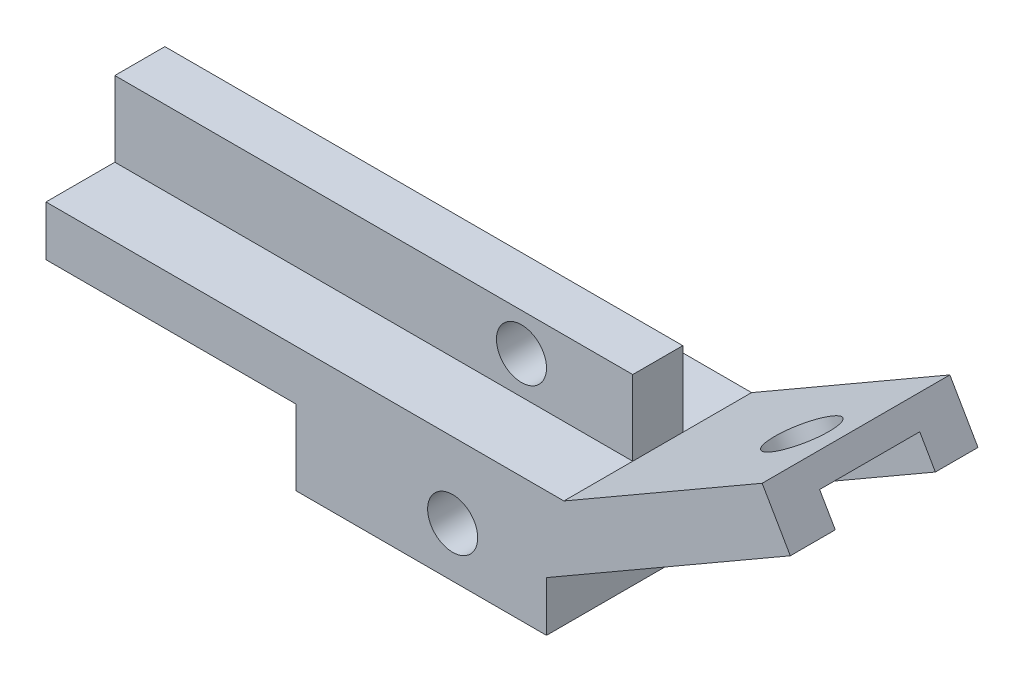
ISO-10303-21;
HEADER;
FILE_DESCRIPTION(('STEP AP214'),'2;1');
FILE_NAME('part.step','',(''),(''),'','','');
FILE_SCHEMA(('AUTOMOTIVE_DESIGN { 1 0 10303 214 1 1 1 1 }'));
ENDSEC;
DATA;
#1=APPLICATION_CONTEXT('core data for automotive mechanical design processes');
#2=APPLICATION_PROTOCOL_DEFINITION('international standard','automotive_design',2000,#1);
#3=PRODUCT_CONTEXT('',#1,'mechanical');
#4=PRODUCT('Part','Part','',(#3));
#5=PRODUCT_RELATED_PRODUCT_CATEGORY('part','',(#4));
#6=PRODUCT_DEFINITION_FORMATION('','',#4);
#7=PRODUCT_DEFINITION_CONTEXT('part definition',#1,'design');
#8=PRODUCT_DEFINITION('design','',#6,#7);
#9=PRODUCT_DEFINITION_SHAPE('','',#8);
#10=(LENGTH_UNIT() NAMED_UNIT(*) SI_UNIT(.MILLI.,.METRE.));
#11=(NAMED_UNIT(*) PLANE_ANGLE_UNIT() SI_UNIT($,.RADIAN.));
#12=(NAMED_UNIT(*) SI_UNIT($,.STERADIAN.) SOLID_ANGLE_UNIT());
#13=UNCERTAINTY_MEASURE_WITH_UNIT(LENGTH_MEASURE(1.E-05),#10,'distance_accuracy_value','');
#14=(GEOMETRIC_REPRESENTATION_CONTEXT(3) GLOBAL_UNCERTAINTY_ASSIGNED_CONTEXT((#13)) GLOBAL_UNIT_ASSIGNED_CONTEXT((#10,
#11,#12)) REPRESENTATION_CONTEXT('',''));
#15=CARTESIAN_POINT('',(0.,0.,0.));
#16=DIRECTION('',(0.,0.,1.));
#17=DIRECTION('',(1.,0.,0.));
#18=AXIS2_PLACEMENT_3D('',#15,#16,#17);
#19=CARTESIAN_POINT('',(0.,8.,15.));
#20=DIRECTION('',(0.,-1.,0.));
#21=DIRECTION('',(1.,0.,0.));
#22=AXIS2_PLACEMENT_3D('',#19,#20,#21);
#23=PLANE('',#22);
#24=DIRECTION('',(-1.,0.,0.));
#25=VECTOR('',#24,1.);
#26=CARTESIAN_POINT('',(0.,8.,-4.));
#27=LINE('',#26,#25);
#28=CARTESIAN_POINT('',(82.7846096908267,8.,-4.));
#29=VERTEX_POINT('',#28);
#30=CARTESIAN_POINT('',(0.,8.,-4.));
#31=VERTEX_POINT('',#30);
#32=EDGE_CURVE('E58',#29,#31,#27,.T.);
#33=ORIENTED_EDGE('',*,*,#32,.F.);
#34=DIRECTION('',(0.,0.,-1.));
#35=VECTOR('',#34,1.);
#36=CARTESIAN_POINT('',(82.7846096908267,8.,15.));
#37=LINE('',#36,#35);
#38=CARTESIAN_POINT('',(82.7846096908267,8.,-15.));
#39=VERTEX_POINT('',#38);
#40=EDGE_CURVE('E43',#29,#39,#37,.T.);
#41=ORIENTED_EDGE('',*,*,#40,.T.);
#42=DIRECTION('',(-1.,0.,0.));
#43=VECTOR('',#42,1.);
#44=CARTESIAN_POINT('',(0.,8.,-15.));
#45=LINE('',#44,#43);
#46=CARTESIAN_POINT('',(0.,8.,-15.));
#47=VERTEX_POINT('',#46);
#48=EDGE_CURVE('E254',#39,#47,#45,.T.);
#49=ORIENTED_EDGE('',*,*,#48,.T.);
#50=DIRECTION('',(0.,0.,-1.));
#51=VECTOR('',#50,1.);
#52=CARTESIAN_POINT('',(0.,8.,15.));
#53=LINE('',#52,#51);
#54=EDGE_CURVE('E295',#31,#47,#53,.T.);
#55=ORIENTED_EDGE('',*,*,#54,.F.);
#56=EDGE_LOOP('',(#33,#41,#49,#55));
#57=FACE_BOUND('',#56,.T.);
#58=ADVANCED_FACE('F34',(#57),#23,.F.);
#59=CARTESIAN_POINT('',(17.2320508075693,-29.8467875173179,15.));
#60=DIRECTION('',(0.500000000000004,-0.866025403784436,0.));
#61=DIRECTION('',(0.866025403784436,0.500000000000004,0.));
#62=AXIS2_PLACEMENT_3D('',#59,#60,#61);
#63=PLANE('',#62);
#64=CARTESIAN_POINT('',(105.810889132455,21.29422863406,0.));
#65=DIRECTION('',(-0.500000000000004,0.866025403784436,0.));
#66=DIRECTION('',(-0.866025403784436,-0.500000000000004,0.));
#67=AXIS2_PLACEMENT_3D('',#64,#65,#66);
#68=CIRCLE('',#67,5.00000000000001);
#69=CARTESIAN_POINT('',(101.480762113533,18.79422863406,0.));
#70=VERTEX_POINT('',#69);
#71=EDGE_CURVE('E190',#70,#70,#68,.T.);
#72=ORIENTED_EDGE('',*,*,#71,.F.);
#73=EDGE_LOOP('',(#72));
#74=FACE_BOUND('',#73,.T.);
#75=DIRECTION('',(-0.866025403784436,-0.500000000000004,0.));
#76=VECTOR('',#75,1.);
#77=CARTESIAN_POINT('',(17.2320508075693,-29.8467875173179,-15.));
#78=LINE('',#77,#76);
#79=CARTESIAN_POINT('',(114.4711431703,26.29422863406,-15.));
#80=VERTEX_POINT('',#79);
#81=EDGE_CURVE('E227',#80,#39,#78,.T.);
#82=ORIENTED_EDGE('',*,*,#81,.T.);
#83=ORIENTED_EDGE('',*,*,#40,.F.);
#84=DIRECTION('',(0.,0.,-1.));
#85=VECTOR('',#84,1.);
#86=CARTESIAN_POINT('',(82.7846096908267,8.,4.));
#87=LINE('',#86,#85);
#88=CARTESIAN_POINT('',(82.7846096908267,8.,4.));
#89=VERTEX_POINT('',#88);
#90=EDGE_CURVE('E225',#89,#29,#87,.T.);
#91=ORIENTED_EDGE('',*,*,#90,.F.);
#92=CARTESIAN_POINT('',(82.7846096908267,8.,15.));
#93=VERTEX_POINT('',#92);
#94=EDGE_CURVE('E11',#93,#89,#37,.T.);
#95=ORIENTED_EDGE('',*,*,#94,.F.);
#96=DIRECTION('',(-0.866025403784436,-0.500000000000004,0.));
#97=VECTOR('',#96,1.);
#98=CARTESIAN_POINT('',(17.2320508075693,-29.8467875173179,15.));
#99=LINE('',#98,#97);
#100=CARTESIAN_POINT('',(114.4711431703,26.29422863406,15.));
#101=VERTEX_POINT('',#100);
#102=EDGE_CURVE('E228',#101,#93,#99,.T.);
#103=ORIENTED_EDGE('',*,*,#102,.F.);
#104=DIRECTION('',(0.,0.,-1.));
#105=VECTOR('',#104,1.);
#106=CARTESIAN_POINT('',(114.4711431703,26.29422863406,15.));
#107=LINE('',#106,#105);
#108=EDGE_CURVE('E251',#101,#80,#107,.T.);
#109=ORIENTED_EDGE('',*,*,#108,.T.);
#110=EDGE_LOOP('',(#82,#83,#91,#95,#103,#109));
#111=FACE_BOUND('',#110,.T.);
#112=ADVANCED_FACE('F36',(#74,#111),#63,.F.);
#113=ORIENTED_EDGE('',*,*,#94,.T.);
#114=DIRECTION('',(-1.,0.,0.));
#115=VECTOR('',#114,1.);
#116=CARTESIAN_POINT('',(0.,8.,4.));
#117=LINE('',#116,#115);
#118=CARTESIAN_POINT('',(0.,8.,4.));
#119=VERTEX_POINT('',#118);
#120=EDGE_CURVE('E197',#89,#119,#117,.T.);
#121=ORIENTED_EDGE('',*,*,#120,.T.);
#122=CARTESIAN_POINT('',(0.,8.,15.));
#123=VERTEX_POINT('',#122);
#124=EDGE_CURVE('E296',#123,#119,#53,.T.);
#125=ORIENTED_EDGE('',*,*,#124,.F.);
#126=DIRECTION('',(-1.,0.,0.));
#127=VECTOR('',#126,1.);
#128=CARTESIAN_POINT('',(0.,8.,15.));
#129=LINE('',#128,#127);
#130=EDGE_CURVE('E231',#93,#123,#129,.T.);
#131=ORIENTED_EDGE('',*,*,#130,.F.);
#132=EDGE_LOOP('',(#113,#121,#125,#131));
#133=FACE_BOUND('',#132,.T.);
#134=ADVANCED_FACE('F331',(#133),#23,.F.);
#135=CARTESIAN_POINT('',(0.,0.,15.));
#136=DIRECTION('',(1.,0.,0.));
#137=DIRECTION('',(0.,1.,0.));
#138=AXIS2_PLACEMENT_3D('',#135,#136,#137);
#139=PLANE('',#138);
#140=DIRECTION('',(0.,-1.,0.));
#141=VECTOR('',#140,1.);
#142=CARTESIAN_POINT('',(0.,0.,-15.));
#143=LINE('',#142,#141);
#144=CARTESIAN_POINT('',(0.,0.,-15.));
#145=VERTEX_POINT('',#144);
#146=EDGE_CURVE('E257',#47,#145,#143,.T.);
#147=ORIENTED_EDGE('',*,*,#146,.T.);
#148=DIRECTION('',(0.,0.,-1.));
#149=VECTOR('',#148,1.);
#150=CARTESIAN_POINT('',(0.,0.,15.));
#151=LINE('',#150,#149);
#152=CARTESIAN_POINT('',(0.,0.,15.));
#153=VERTEX_POINT('',#152);
#154=EDGE_CURVE('E292',#153,#145,#151,.T.);
#155=ORIENTED_EDGE('',*,*,#154,.F.);
#156=DIRECTION('',(0.,-1.,0.));
#157=VECTOR('',#156,1.);
#158=CARTESIAN_POINT('',(0.,0.,15.));
#159=LINE('',#158,#157);
#160=EDGE_CURVE('E234',#123,#153,#159,.T.);
#161=ORIENTED_EDGE('',*,*,#160,.F.);
#162=ORIENTED_EDGE('',*,*,#124,.T.);
#163=DIRECTION('',(0.,-1.,0.));
#164=VECTOR('',#163,1.);
#165=CARTESIAN_POINT('',(0.,0.,4.));
#166=LINE('',#165,#164);
#167=CARTESIAN_POINT('',(0.,20.,4.));
#168=VERTEX_POINT('',#167);
#169=EDGE_CURVE('E207',#168,#119,#166,.T.);
#170=ORIENTED_EDGE('',*,*,#169,.F.);
#171=DIRECTION('',(0.,0.,-1.));
#172=VECTOR('',#171,1.);
#173=CARTESIAN_POINT('',(0.,20.,4.));
#174=LINE('',#173,#172);
#175=CARTESIAN_POINT('',(0.,20.,-4.));
#176=VERTEX_POINT('',#175);
#177=EDGE_CURVE('E209',#168,#176,#174,.T.);
#178=ORIENTED_EDGE('',*,*,#177,.T.);
#179=DIRECTION('',(0.,-1.,0.));
#180=VECTOR('',#179,1.);
#181=CARTESIAN_POINT('',(0.,0.,-4.));
#182=LINE('',#181,#180);
#183=EDGE_CURVE('E198',#176,#31,#182,.T.);
#184=ORIENTED_EDGE('',*,*,#183,.T.);
#185=ORIENTED_EDGE('',*,*,#54,.T.);
#186=EDGE_LOOP('',(#147,#155,#161,#162,#170,#178,#184,#185));
#187=FACE_BOUND('',#186,.T.);
#188=ADVANCED_FACE('F302',(#187),#139,.F.);
#189=CARTESIAN_POINT('',(0.,0.,15.));
#190=DIRECTION('',(0.,1.,0.));
#191=DIRECTION('',(0.,0.,1.));
#192=AXIS2_PLACEMENT_3D('',#189,#190,#191);
#193=PLANE('',#192);
#194=DIRECTION('',(1.,0.,0.));
#195=VECTOR('',#194,1.);
#196=CARTESIAN_POINT('',(0.,0.,-15.));
#197=LINE('',#196,#195);
#198=CARTESIAN_POINT('',(40.,0.,-15.));
#199=VERTEX_POINT('',#198);
#200=EDGE_CURVE('E259',#145,#199,#197,.T.);
#201=ORIENTED_EDGE('',*,*,#200,.T.);
#202=DIRECTION('',(0.,0.,-1.));
#203=VECTOR('',#202,1.);
#204=CARTESIAN_POINT('',(40.,0.,15.));
#205=LINE('',#204,#203);
#206=CARTESIAN_POINT('',(40.,0.,15.));
#207=VERTEX_POINT('',#206);
#208=EDGE_CURVE('E289',#207,#199,#205,.T.);
#209=ORIENTED_EDGE('',*,*,#208,.F.);
#210=DIRECTION('',(1.,0.,0.));
#211=VECTOR('',#210,1.);
#212=CARTESIAN_POINT('',(0.,0.,15.));
#213=LINE('',#212,#211);
#214=EDGE_CURVE('E236',#153,#207,#213,.T.);
#215=ORIENTED_EDGE('',*,*,#214,.F.);
#216=ORIENTED_EDGE('',*,*,#154,.T.);
#217=EDGE_LOOP('',(#201,#209,#215,#216));
#218=FACE_BOUND('',#217,.T.);
#219=ADVANCED_FACE('F317',(#218),#193,.F.);
#220=CARTESIAN_POINT('',(40.,0.,15.));
#221=DIRECTION('',(1.,0.,0.));
#222=DIRECTION('',(0.,0.,-1.));
#223=AXIS2_PLACEMENT_3D('',#220,#221,#222);
#224=PLANE('',#223);
#225=DIRECTION('',(0.,-1.,0.));
#226=VECTOR('',#225,1.);
#227=CARTESIAN_POINT('',(40.,0.,-15.));
#228=LINE('',#227,#226);
#229=CARTESIAN_POINT('',(40.,-12.,-15.));
#230=VERTEX_POINT('',#229);
#231=EDGE_CURVE('E261',#199,#230,#228,.T.);
#232=ORIENTED_EDGE('',*,*,#231,.T.);
#233=DIRECTION('',(0.,0.,-1.));
#234=VECTOR('',#233,1.);
#235=CARTESIAN_POINT('',(40.,-12.,15.));
#236=LINE('',#235,#234);
#237=CARTESIAN_POINT('',(40.,-12.,15.));
#238=VERTEX_POINT('',#237);
#239=EDGE_CURVE('E286',#238,#230,#236,.T.);
#240=ORIENTED_EDGE('',*,*,#239,.F.);
#241=DIRECTION('',(0.,-1.,0.));
#242=VECTOR('',#241,1.);
#243=CARTESIAN_POINT('',(40.,0.,15.));
#244=LINE('',#243,#242);
#245=EDGE_CURVE('E238',#207,#238,#244,.T.);
#246=ORIENTED_EDGE('',*,*,#245,.F.);
#247=ORIENTED_EDGE('',*,*,#208,.T.);
#248=EDGE_LOOP('',(#232,#240,#246,#247));
#249=FACE_BOUND('',#248,.T.);
#250=ADVANCED_FACE('F321',(#249),#224,.F.);
#251=CARTESIAN_POINT('',(0.,-12.,15.));
#252=DIRECTION('',(0.,1.,0.));
#253=DIRECTION('',(0.,0.,1.));
#254=AXIS2_PLACEMENT_3D('',#251,#252,#253);
#255=PLANE('',#254);
#256=DIRECTION('',(1.,0.,0.));
#257=VECTOR('',#256,1.);
#258=CARTESIAN_POINT('',(0.,-12.,-15.));
#259=LINE('',#258,#257);
#260=CARTESIAN_POINT('',(80.,-12.,-15.));
#261=VERTEX_POINT('',#260);
#262=EDGE_CURVE('E263',#230,#261,#259,.T.);
#263=ORIENTED_EDGE('',*,*,#262,.T.);
#264=DIRECTION('',(0.,0.,-1.));
#265=VECTOR('',#264,1.);
#266=CARTESIAN_POINT('',(80.,-12.,15.));
#267=LINE('',#266,#265);
#268=CARTESIAN_POINT('',(80.,-12.,15.));
#269=VERTEX_POINT('',#268);
#270=EDGE_CURVE('E283',#269,#261,#267,.T.);
#271=ORIENTED_EDGE('',*,*,#270,.F.);
#272=DIRECTION('',(1.,0.,0.));
#273=VECTOR('',#272,1.);
#274=CARTESIAN_POINT('',(0.,-12.,15.));
#275=LINE('',#274,#273);
#276=EDGE_CURVE('E240',#238,#269,#275,.T.);
#277=ORIENTED_EDGE('',*,*,#276,.F.);
#278=ORIENTED_EDGE('',*,*,#239,.T.);
#279=EDGE_LOOP('',(#263,#271,#277,#278));
#280=FACE_BOUND('',#279,.T.);
#281=ADVANCED_FACE('F372',(#280),#255,.F.);
#282=CARTESIAN_POINT('',(80.,0.,15.));
#283=DIRECTION('',(-1.,0.,0.));
#284=DIRECTION('',(0.,0.,1.));
#285=AXIS2_PLACEMENT_3D('',#282,#283,#284);
#286=PLANE('',#285);
#287=DIRECTION('',(0.,1.,0.));
#288=VECTOR('',#287,1.);
#289=CARTESIAN_POINT('',(80.,0.,-15.));
#290=LINE('',#289,#288);
#291=CARTESIAN_POINT('',(80.,-4.,-15.));
#292=VERTEX_POINT('',#291);
#293=EDGE_CURVE('E265',#261,#292,#290,.T.);
#294=ORIENTED_EDGE('',*,*,#293,.T.);
#295=DIRECTION('',(0.,0.,-1.));
#296=VECTOR('',#295,1.);
#297=CARTESIAN_POINT('',(80.,-4.,15.));
#298=LINE('',#297,#296);
#299=CARTESIAN_POINT('',(80.,-4.,15.));
#300=VERTEX_POINT('',#299);
#301=EDGE_CURVE('E280',#300,#292,#298,.T.);
#302=ORIENTED_EDGE('',*,*,#301,.F.);
#303=DIRECTION('',(0.,1.,0.));
#304=VECTOR('',#303,1.);
#305=CARTESIAN_POINT('',(80.,0.,15.));
#306=LINE('',#305,#304);
#307=EDGE_CURVE('E242',#269,#300,#306,.T.);
#308=ORIENTED_EDGE('',*,*,#307,.F.);
#309=ORIENTED_EDGE('',*,*,#270,.T.);
#310=EDGE_LOOP('',(#294,#302,#308,#309));
#311=FACE_BOUND('',#310,.T.);
#312=ADVANCED_FACE('F375',(#311),#286,.F.);
#313=CARTESIAN_POINT('',(21.7320508075692,-37.6410161513777,15.));
#314=DIRECTION('',(-0.500000000000004,0.866025403784436,0.));
#315=DIRECTION('',(-0.866025403784436,-0.500000000000005,0.));
#316=AXIS2_PLACEMENT_3D('',#313,#314,#315);
#317=PLANE('',#316);
#318=DIRECTION('',(0.,0.,-1.));
#319=VECTOR('',#318,1.);
#320=CARTESIAN_POINT('',(118.9711431703,18.5000000000002,15.));
#321=LINE('',#320,#319);
#322=CARTESIAN_POINT('',(118.9711431703,18.5000000000002,-8.18824424617436));
#323=VERTEX_POINT('',#322);
#324=CARTESIAN_POINT('',(118.9711431703,18.5000000000002,-15.));
#325=VERTEX_POINT('',#324);
#326=EDGE_CURVE('E276',#323,#325,#321,.T.);
#327=ORIENTED_EDGE('',*,*,#326,.F.);
#328=DIRECTION('',(0.866025403784436,0.500000000000004,0.));
#329=VECTOR('',#328,1.);
#330=CARTESIAN_POINT('',(92.9903810567666,3.50000000000009,-8.18824424617436));
#331=LINE('',#330,#329);
#332=CARTESIAN_POINT('',(92.9903810567666,3.50000000000009,-8.18824424617436));
#333=VERTEX_POINT('',#332);
#334=EDGE_CURVE('E187',#333,#323,#331,.T.);
#335=ORIENTED_EDGE('',*,*,#334,.F.);
#336=DIRECTION('',(0.,0.,-1.));
#337=VECTOR('',#336,1.);
#338=CARTESIAN_POINT('',(92.9903810567666,3.50000000000009,0.));
#339=LINE('',#338,#337);
#340=CARTESIAN_POINT('',(92.9903810567666,3.50000000000009,7.81175575382565));
#341=VERTEX_POINT('',#340);
#342=EDGE_CURVE('E171',#341,#333,#339,.T.);
#343=ORIENTED_EDGE('',*,*,#342,.F.);
#344=DIRECTION('',(0.866025403784436,0.500000000000004,0.));
#345=VECTOR('',#344,1.);
#346=CARTESIAN_POINT('',(92.9903810567666,3.50000000000009,7.81175575382565));
#347=LINE('',#346,#345);
#348=CARTESIAN_POINT('',(118.9711431703,18.5000000000002,7.81175575382565));
#349=VERTEX_POINT('',#348);
#350=EDGE_CURVE('E162',#341,#349,#347,.T.);
#351=ORIENTED_EDGE('',*,*,#350,.T.);
#352=CARTESIAN_POINT('',(118.9711431703,18.5000000000002,15.));
#353=VERTEX_POINT('',#352);
#354=EDGE_CURVE('E277',#353,#349,#321,.T.);
#355=ORIENTED_EDGE('',*,*,#354,.F.);
#356=DIRECTION('',(0.866025403784436,0.500000000000005,0.));
#357=VECTOR('',#356,1.);
#358=CARTESIAN_POINT('',(21.7320508075692,-37.6410161513777,15.));
#359=LINE('',#358,#357);
#360=EDGE_CURVE('E244',#300,#353,#359,.T.);
#361=ORIENTED_EDGE('',*,*,#360,.F.);
#362=ORIENTED_EDGE('',*,*,#301,.T.);
#363=DIRECTION('',(0.866025403784436,0.500000000000005,0.));
#364=VECTOR('',#363,1.);
#365=CARTESIAN_POINT('',(21.7320508075692,-37.6410161513777,-15.));
#366=LINE('',#365,#364);
#367=EDGE_CURVE('E267',#292,#325,#366,.T.);
#368=ORIENTED_EDGE('',*,*,#367,.T.);
#369=EDGE_LOOP('',(#327,#335,#343,#351,#355,#361,#362,#368));
#370=FACE_BOUND('',#369,.T.);
#371=ADVANCED_FACE('F379',(#370),#317,.F.);
#372=CARTESIAN_POINT('',(97.2390923627304,56.1410161513779,15.));
#373=DIRECTION('',(-0.866025403784436,-0.500000000000004,0.));
#374=DIRECTION('',(0.500000000000004,-0.866025403784436,0.));
#375=AXIS2_PLACEMENT_3D('',#372,#373,#374);
#376=PLANE('',#375);
#377=DIRECTION('',(0.,0.,1.));
#378=VECTOR('',#377,1.);
#379=CARTESIAN_POINT('',(116.4711431703,22.8301270189223,0.));
#380=LINE('',#379,#378);
#381=CARTESIAN_POINT('',(116.4711431703,22.8301270189223,-8.18824424617436));
#382=VERTEX_POINT('',#381);
#383=CARTESIAN_POINT('',(116.4711431703,22.8301270189223,7.81175575382565));
#384=VERTEX_POINT('',#383);
#385=EDGE_CURVE('E50',#382,#384,#380,.T.);
#386=ORIENTED_EDGE('',*,*,#385,.F.);
#387=DIRECTION('',(-0.500000000000004,0.866025403784436,0.));
#388=VECTOR('',#387,1.);
#389=CARTESIAN_POINT('',(97.2390923627304,56.1410161513779,-8.18824424617436));
#390=LINE('',#389,#388);
#391=EDGE_CURVE('E175',#323,#382,#390,.T.);
#392=ORIENTED_EDGE('',*,*,#391,.F.);
#393=ORIENTED_EDGE('',*,*,#326,.T.);
#394=DIRECTION('',(-0.500000000000004,0.866025403784436,0.));
#395=VECTOR('',#394,1.);
#396=CARTESIAN_POINT('',(97.2390923627304,56.1410161513779,-15.));
#397=LINE('',#396,#395);
#398=EDGE_CURVE('E270',#325,#80,#397,.T.);
#399=ORIENTED_EDGE('',*,*,#398,.T.);
#400=ORIENTED_EDGE('',*,*,#108,.F.);
#401=DIRECTION('',(-0.500000000000004,0.866025403784436,0.));
#402=VECTOR('',#401,1.);
#403=CARTESIAN_POINT('',(97.2390923627304,56.1410161513779,15.));
#404=LINE('',#403,#402);
#405=EDGE_CURVE('E246',#353,#101,#404,.T.);
#406=ORIENTED_EDGE('',*,*,#405,.F.);
#407=ORIENTED_EDGE('',*,*,#354,.T.);
#408=DIRECTION('',(0.500000000000004,-0.866025403784436,0.));
#409=VECTOR('',#408,1.);
#410=CARTESIAN_POINT('',(97.2390923627304,56.1410161513779,7.81175575382565));
#411=LINE('',#410,#409);
#412=EDGE_CURVE('E178',#384,#349,#411,.T.);
#413=ORIENTED_EDGE('',*,*,#412,.F.);
#414=EDGE_LOOP('',(#386,#392,#393,#399,#400,#406,#407,#413));
#415=FACE_BOUND('',#414,.T.);
#416=ADVANCED_FACE('F383',(#415),#376,.F.);
#417=CARTESIAN_POINT('',(65.,-4.,15.));
#418=DIRECTION('',(0.,0.,-1.));
#419=DIRECTION('',(-1.,0.,0.));
#420=AXIS2_PLACEMENT_3D('',#417,#418,#419);
#421=CYLINDRICAL_SURFACE('',#420,4.00000000000001);
#422=CARTESIAN_POINT('',(65.,-4.,15.));
#423=DIRECTION('',(0.,0.,1.));
#424=DIRECTION('',(1.,0.,0.));
#425=AXIS2_PLACEMENT_3D('',#422,#423,#424);
#426=CIRCLE('',#425,4.00000000000001);
#427=CARTESIAN_POINT('',(69.,-4.,15.));
#428=VERTEX_POINT('',#427);
#429=EDGE_CURVE('E248',#428,#428,#426,.T.);
#430=ORIENTED_EDGE('',*,*,#429,.T.);
#431=EDGE_LOOP('',(#430));
#432=FACE_BOUND('',#431,.T.);
#433=CARTESIAN_POINT('',(65.,-4.,-15.));
#434=DIRECTION('',(0.,0.,1.));
#435=DIRECTION('',(1.,0.,0.));
#436=AXIS2_PLACEMENT_3D('',#433,#434,#435);
#437=CIRCLE('',#436,4.00000000000001);
#438=CARTESIAN_POINT('',(69.,-4.,-15.));
#439=VERTEX_POINT('',#438);
#440=EDGE_CURVE('E232',#439,#439,#437,.T.);
#441=ORIENTED_EDGE('',*,*,#440,.F.);
#442=EDGE_LOOP('',(#441));
#443=FACE_BOUND('',#442,.T.);
#444=ADVANCED_FACE('F387',(#432,#443),#421,.F.);
#445=CARTESIAN_POINT('',(0.,0.,15.));
#446=DIRECTION('',(0.,0.,1.));
#447=DIRECTION('',(1.,0.,0.));
#448=AXIS2_PLACEMENT_3D('',#445,#446,#447);
#449=PLANE('',#448);
#450=ORIENTED_EDGE('',*,*,#102,.T.);
#451=ORIENTED_EDGE('',*,*,#130,.T.);
#452=ORIENTED_EDGE('',*,*,#160,.T.);
#453=ORIENTED_EDGE('',*,*,#214,.T.);
#454=ORIENTED_EDGE('',*,*,#245,.T.);
#455=ORIENTED_EDGE('',*,*,#276,.T.);
#456=ORIENTED_EDGE('',*,*,#307,.T.);
#457=ORIENTED_EDGE('',*,*,#360,.T.);
#458=ORIENTED_EDGE('',*,*,#405,.T.);
#459=EDGE_LOOP('',(#450,#451,#452,#453,#454,#455,#456,#457,#458));
#460=FACE_BOUND('',#459,.T.);
#461=ORIENTED_EDGE('',*,*,#429,.F.);
#462=EDGE_LOOP('',(#461));
#463=FACE_BOUND('',#462,.T.);
#464=ADVANCED_FACE('F325',(#460,#463),#449,.T.);
#465=CARTESIAN_POINT('',(0.,0.,-15.));
#466=DIRECTION('',(0.,0.,1.));
#467=DIRECTION('',(1.,0.,0.));
#468=AXIS2_PLACEMENT_3D('',#465,#466,#467);
#469=PLANE('',#468);
#470=ORIENTED_EDGE('',*,*,#81,.F.);
#471=ORIENTED_EDGE('',*,*,#398,.F.);
#472=ORIENTED_EDGE('',*,*,#367,.F.);
#473=ORIENTED_EDGE('',*,*,#293,.F.);
#474=ORIENTED_EDGE('',*,*,#262,.F.);
#475=ORIENTED_EDGE('',*,*,#231,.F.);
#476=ORIENTED_EDGE('',*,*,#200,.F.);
#477=ORIENTED_EDGE('',*,*,#146,.F.);
#478=ORIENTED_EDGE('',*,*,#48,.F.);
#479=EDGE_LOOP('',(#470,#471,#472,#473,#474,#475,#476,#477,#478));
#480=FACE_BOUND('',#479,.T.);
#481=ORIENTED_EDGE('',*,*,#440,.T.);
#482=EDGE_LOOP('',(#481));
#483=FACE_BOUND('',#482,.T.);
#484=ADVANCED_FACE('F311',(#480,#483),#469,.F.);
#485=CARTESIAN_POINT('',(82.7846096908267,0.,4.));
#486=DIRECTION('',(-1.,0.,0.));
#487=DIRECTION('',(0.,0.,1.));
#488=AXIS2_PLACEMENT_3D('',#485,#486,#487);
#489=PLANE('',#488);
#490=DIRECTION('',(0.,1.,0.));
#491=VECTOR('',#490,1.);
#492=CARTESIAN_POINT('',(82.7846096908267,0.,-4.));
#493=LINE('',#492,#491);
#494=CARTESIAN_POINT('',(82.7846096908267,20.,-4.));
#495=VERTEX_POINT('',#494);
#496=EDGE_CURVE('E213',#29,#495,#493,.T.);
#497=ORIENTED_EDGE('',*,*,#496,.T.);
#498=DIRECTION('',(0.,0.,-1.));
#499=VECTOR('',#498,1.);
#500=CARTESIAN_POINT('',(82.7846096908267,20.,4.));
#501=LINE('',#500,#499);
#502=CARTESIAN_POINT('',(82.7846096908267,20.,4.));
#503=VERTEX_POINT('',#502);
#504=EDGE_CURVE('E222',#503,#495,#501,.T.);
#505=ORIENTED_EDGE('',*,*,#504,.F.);
#506=DIRECTION('',(0.,1.,0.));
#507=VECTOR('',#506,1.);
#508=CARTESIAN_POINT('',(82.7846096908267,0.,4.));
#509=LINE('',#508,#507);
#510=EDGE_CURVE('E201',#89,#503,#509,.T.);
#511=ORIENTED_EDGE('',*,*,#510,.F.);
#512=ORIENTED_EDGE('',*,*,#90,.T.);
#513=EDGE_LOOP('',(#497,#505,#511,#512));
#514=FACE_BOUND('',#513,.T.);
#515=ADVANCED_FACE('F339',(#514),#489,.F.);
#516=CARTESIAN_POINT('',(0.,20.,4.));
#517=DIRECTION('',(0.,-1.,0.));
#518=DIRECTION('',(1.,0.,0.));
#519=AXIS2_PLACEMENT_3D('',#516,#517,#518);
#520=PLANE('',#519);
#521=DIRECTION('',(-1.,0.,0.));
#522=VECTOR('',#521,1.);
#523=CARTESIAN_POINT('',(0.,20.,-4.));
#524=LINE('',#523,#522);
#525=EDGE_CURVE('E216',#495,#176,#524,.T.);
#526=ORIENTED_EDGE('',*,*,#525,.T.);
#527=ORIENTED_EDGE('',*,*,#177,.F.);
#528=DIRECTION('',(-1.,0.,0.));
#529=VECTOR('',#528,1.);
#530=CARTESIAN_POINT('',(0.,20.,4.));
#531=LINE('',#530,#529);
#532=EDGE_CURVE('E204',#503,#168,#531,.T.);
#533=ORIENTED_EDGE('',*,*,#532,.F.);
#534=ORIENTED_EDGE('',*,*,#504,.T.);
#535=EDGE_LOOP('',(#526,#527,#533,#534));
#536=FACE_BOUND('',#535,.T.);
#537=ADVANCED_FACE('F343',(#536),#520,.F.);
#538=CARTESIAN_POINT('',(65.,14.,4.));
#539=DIRECTION('',(0.,0.,-1.));
#540=DIRECTION('',(-1.,0.,0.));
#541=AXIS2_PLACEMENT_3D('',#538,#539,#540);
#542=CYLINDRICAL_SURFACE('',#541,4.00000000000001);
#543=CARTESIAN_POINT('',(65.,14.,4.));
#544=DIRECTION('',(0.,0.,1.));
#545=DIRECTION('',(1.,0.,0.));
#546=AXIS2_PLACEMENT_3D('',#543,#544,#545);
#547=CIRCLE('',#546,4.00000000000001);
#548=CARTESIAN_POINT('',(69.,14.,4.));
#549=VERTEX_POINT('',#548);
#550=EDGE_CURVE('E194',#549,#549,#547,.T.);
#551=ORIENTED_EDGE('',*,*,#550,.T.);
#552=EDGE_LOOP('',(#551));
#553=FACE_BOUND('',#552,.T.);
#554=CARTESIAN_POINT('',(65.,14.,-4.));
#555=DIRECTION('',(0.,0.,1.));
#556=DIRECTION('',(1.,0.,0.));
#557=AXIS2_PLACEMENT_3D('',#554,#555,#556);
#558=CIRCLE('',#557,4.00000000000001);
#559=CARTESIAN_POINT('',(69.,14.,-4.));
#560=VERTEX_POINT('',#559);
#561=EDGE_CURVE('E193',#560,#560,#558,.T.);
#562=ORIENTED_EDGE('',*,*,#561,.F.);
#563=EDGE_LOOP('',(#562));
#564=FACE_BOUND('',#563,.T.);
#565=ADVANCED_FACE('F345',(#553,#564),#542,.F.);
#566=CARTESIAN_POINT('',(0.,0.,4.));
#567=DIRECTION('',(0.,0.,1.));
#568=DIRECTION('',(1.,0.,0.));
#569=AXIS2_PLACEMENT_3D('',#566,#567,#568);
#570=PLANE('',#569);
#571=ORIENTED_EDGE('',*,*,#550,.F.);
#572=EDGE_LOOP('',(#571));
#573=FACE_BOUND('',#572,.T.);
#574=ORIENTED_EDGE('',*,*,#120,.F.);
#575=ORIENTED_EDGE('',*,*,#510,.T.);
#576=ORIENTED_EDGE('',*,*,#532,.T.);
#577=ORIENTED_EDGE('',*,*,#169,.T.);
#578=EDGE_LOOP('',(#574,#575,#576,#577));
#579=FACE_BOUND('',#578,.T.);
#580=ADVANCED_FACE('F335',(#573,#579),#570,.T.);
#581=CARTESIAN_POINT('',(0.,0.,-4.));
#582=DIRECTION('',(0.,0.,1.));
#583=DIRECTION('',(1.,0.,0.));
#584=AXIS2_PLACEMENT_3D('',#581,#582,#583);
#585=PLANE('',#584);
#586=ORIENTED_EDGE('',*,*,#561,.T.);
#587=EDGE_LOOP('',(#586));
#588=FACE_BOUND('',#587,.T.);
#589=ORIENTED_EDGE('',*,*,#32,.T.);
#590=ORIENTED_EDGE('',*,*,#183,.F.);
#591=ORIENTED_EDGE('',*,*,#525,.F.);
#592=ORIENTED_EDGE('',*,*,#496,.F.);
#593=EDGE_LOOP('',(#589,#590,#591,#592));
#594=FACE_BOUND('',#593,.T.);
#595=ADVANCED_FACE('F340',(#588,#594),#585,.F.);
#596=CARTESIAN_POINT('',(123.517776540168,-9.37499999999985,0.));
#597=DIRECTION('',(-0.500000000000004,0.866025403784436,0.));
#598=DIRECTION('',(-0.866025403784436,-0.500000000000004,0.));
#599=AXIS2_PLACEMENT_3D('',#596,#597,#598);
#600=CYLINDRICAL_SURFACE('',#599,5.00000000000001);
#601=CARTESIAN_POINT('',(107.810889132455,17.8301270189222,0.));
#602=DIRECTION('',(-0.500000000000004,0.866025403784436,0.));
#603=DIRECTION('',(-0.866025403784436,-0.500000000000004,0.));
#604=AXIS2_PLACEMENT_3D('',#601,#602,#603);
#605=CIRCLE('',#604,5.00000000000001);
#606=CARTESIAN_POINT('',(103.480762113533,15.3301270189222,0.));
#607=VERTEX_POINT('',#606);
#608=EDGE_CURVE('E38',#607,#607,#605,.F.);
#609=ORIENTED_EDGE('',*,*,#608,.T.);
#610=EDGE_LOOP('',(#609));
#611=FACE_BOUND('',#610,.T.);
#612=ORIENTED_EDGE('',*,*,#71,.T.);
#613=EDGE_LOOP('',(#612));
#614=FACE_BOUND('',#613,.T.);
#615=ADVANCED_FACE('F439',(#611,#614),#600,.F.);
#616=CARTESIAN_POINT('',(90.4903810567666,7.83012701892214,0.));
#617=DIRECTION('',(-0.500000000000004,0.866025403784436,0.));
#618=DIRECTION('',(-0.866025403784436,-0.500000000000004,0.));
#619=AXIS2_PLACEMENT_3D('',#616,#617,#618);
#620=PLANE('',#619);
#621=ORIENTED_EDGE('',*,*,#385,.T.);
#622=DIRECTION('',(0.866025403784436,0.500000000000004,0.));
#623=VECTOR('',#622,1.);
#624=CARTESIAN_POINT('',(90.4903810567666,7.83012701892214,7.81175575382565));
#625=LINE('',#624,#623);
#626=CARTESIAN_POINT('',(90.4903810567666,7.83012701892214,7.81175575382565));
#627=VERTEX_POINT('',#626);
#628=EDGE_CURVE('E153',#627,#384,#625,.T.);
#629=ORIENTED_EDGE('',*,*,#628,.F.);
#630=DIRECTION('',(0.,0.,1.));
#631=VECTOR('',#630,1.);
#632=CARTESIAN_POINT('',(90.4903810567666,7.83012701892214,0.));
#633=LINE('',#632,#631);
#634=CARTESIAN_POINT('',(90.4903810567666,7.83012701892214,-8.18824424617436));
#635=VERTEX_POINT('',#634);
#636=EDGE_CURVE('E158',#635,#627,#633,.T.);
#637=ORIENTED_EDGE('',*,*,#636,.F.);
#638=DIRECTION('',(0.866025403784436,0.500000000000004,0.));
#639=VECTOR('',#638,1.);
#640=CARTESIAN_POINT('',(90.4903810567666,7.83012701892214,-8.18824424617436));
#641=LINE('',#640,#639);
#642=EDGE_CURVE('E185',#635,#382,#641,.T.);
#643=ORIENTED_EDGE('',*,*,#642,.T.);
#644=EDGE_LOOP('',(#621,#629,#637,#643));
#645=FACE_BOUND('',#644,.T.);
#646=ORIENTED_EDGE('',*,*,#608,.F.);
#647=EDGE_LOOP('',(#646));
#648=FACE_BOUND('',#647,.T.);
#649=ADVANCED_FACE('F155',(#645,#648),#620,.F.);
#650=CARTESIAN_POINT('',(71.2583302491973,41.1410161513778,-8.18824424617436));
#651=DIRECTION('',(0.,0.,-1.));
#652=DIRECTION('',(-1.,0.,0.));
#653=AXIS2_PLACEMENT_3D('',#650,#651,#652);
#654=PLANE('',#653);
#655=ORIENTED_EDGE('',*,*,#391,.T.);
#656=ORIENTED_EDGE('',*,*,#642,.F.);
#657=DIRECTION('',(-0.500000000000004,0.866025403784436,0.));
#658=VECTOR('',#657,1.);
#659=CARTESIAN_POINT('',(71.2583302491973,41.1410161513778,-8.18824424617436));
#660=LINE('',#659,#658);
#661=EDGE_CURVE('E163',#333,#635,#660,.T.);
#662=ORIENTED_EDGE('',*,*,#661,.F.);
#663=ORIENTED_EDGE('',*,*,#334,.T.);
#664=EDGE_LOOP('',(#655,#656,#662,#663));
#665=FACE_BOUND('',#664,.T.);
#666=ADVANCED_FACE('F478',(#665),#654,.F.);
#667=CARTESIAN_POINT('',(71.2583302491973,41.1410161513778,7.81175575382565));
#668=DIRECTION('',(0.,0.,1.));
#669=DIRECTION('',(0.,-1.,0.));
#670=AXIS2_PLACEMENT_3D('',#667,#668,#669);
#671=PLANE('',#670);
#672=ORIENTED_EDGE('',*,*,#412,.T.);
#673=ORIENTED_EDGE('',*,*,#350,.F.);
#674=DIRECTION('',(0.500000000000004,-0.866025403784436,0.));
#675=VECTOR('',#674,1.);
#676=CARTESIAN_POINT('',(71.2583302491973,41.1410161513778,7.81175575382565));
#677=LINE('',#676,#675);
#678=EDGE_CURVE('E166',#627,#341,#677,.T.);
#679=ORIENTED_EDGE('',*,*,#678,.F.);
#680=ORIENTED_EDGE('',*,*,#628,.T.);
#681=EDGE_LOOP('',(#672,#673,#679,#680));
#682=FACE_BOUND('',#681,.T.);
#683=ADVANCED_FACE('F167',(#682),#671,.F.);
#684=CARTESIAN_POINT('',(71.2583302491973,41.1410161513778,0.));
#685=DIRECTION('',(0.866025403784436,0.500000000000004,0.));
#686=DIRECTION('',(-0.500000000000004,0.866025403784436,0.));
#687=AXIS2_PLACEMENT_3D('',#684,#685,#686);
#688=PLANE('',#687);
#689=ORIENTED_EDGE('',*,*,#636,.T.);
#690=ORIENTED_EDGE('',*,*,#678,.T.);
#691=ORIENTED_EDGE('',*,*,#342,.T.);
#692=ORIENTED_EDGE('',*,*,#661,.T.);
#693=EDGE_LOOP('',(#689,#690,#691,#692));
#694=FACE_BOUND('',#693,.T.);
#695=ADVANCED_FACE('F173',(#694),#688,.T.);
#696=CLOSED_SHELL('',(#58,#112,#134,#188,#219,#250,#281,#312,#371,#416,#444,#464,#484,#515,#537,
#565,#580,#595,#615,#649,#666,#683,#695));
#697=MANIFOLD_SOLID_BREP('B2',#696);
#698=ADVANCED_BREP_SHAPE_REPRESENTATION('',(#18,#697),#14);
#699=SHAPE_DEFINITION_REPRESENTATION(#9,#698);
ENDSEC;
END-ISO-10303-21;
